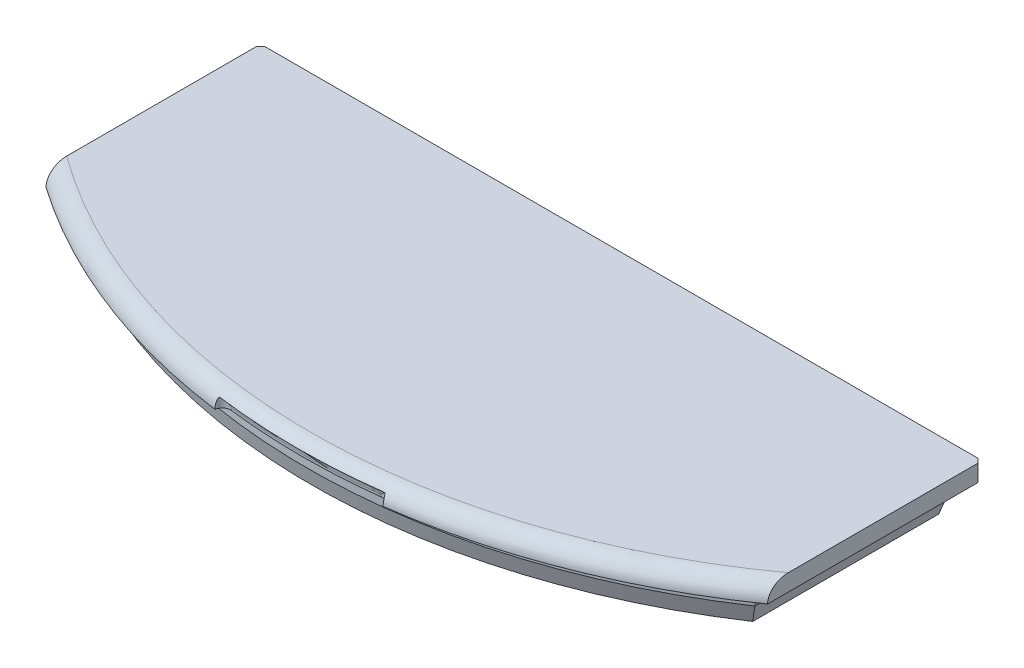
ISO-10303-21;
HEADER;
FILE_DESCRIPTION(('STEP AP214'),'2;1');
FILE_NAME('part.step','',(''),(''),'','','');
FILE_SCHEMA(('AUTOMOTIVE_DESIGN { 1 0 10303 214 1 1 1 1 }'));
ENDSEC;
DATA;
#1=APPLICATION_CONTEXT('core data for automotive mechanical design processes');
#2=APPLICATION_PROTOCOL_DEFINITION('international standard','automotive_design',2000,#1);
#3=PRODUCT_CONTEXT('',#1,'mechanical');
#4=PRODUCT('Part','Part','',(#3));
#5=PRODUCT_RELATED_PRODUCT_CATEGORY('part','',(#4));
#6=PRODUCT_DEFINITION_FORMATION('','',#4);
#7=PRODUCT_DEFINITION_CONTEXT('part definition',#1,'design');
#8=PRODUCT_DEFINITION('design','',#6,#7);
#9=PRODUCT_DEFINITION_SHAPE('','',#8);
#10=(LENGTH_UNIT() NAMED_UNIT(*) SI_UNIT(.MILLI.,.METRE.));
#11=(NAMED_UNIT(*) PLANE_ANGLE_UNIT() SI_UNIT($,.RADIAN.));
#12=(NAMED_UNIT(*) SI_UNIT($,.STERADIAN.) SOLID_ANGLE_UNIT());
#13=UNCERTAINTY_MEASURE_WITH_UNIT(LENGTH_MEASURE(1.E-05),#10,'distance_accuracy_value','');
#14=(GEOMETRIC_REPRESENTATION_CONTEXT(3) GLOBAL_UNCERTAINTY_ASSIGNED_CONTEXT((#13)) GLOBAL_UNIT_ASSIGNED_CONTEXT((#10,
#11,#12)) REPRESENTATION_CONTEXT('',''));
#15=CARTESIAN_POINT('',(0.,0.,0.));
#16=DIRECTION('',(0.,0.,1.));
#17=DIRECTION('',(1.,0.,0.));
#18=AXIS2_PLACEMENT_3D('',#15,#16,#17);
#19=CARTESIAN_POINT('',(0.,0.,0.));
#20=DIRECTION('',(0.,1.,0.));
#21=DIRECTION('',(0.,0.,1.));
#22=AXIS2_PLACEMENT_3D('',#19,#20,#21);
#23=PLANE('',#22);
#24=CARTESIAN_POINT('',(0.,0.,0.));
#25=DIRECTION('',(0.,1.,0.));
#26=DIRECTION('',(0.,0.,-1.));
#27=AXIS2_PLACEMENT_3D('',#24,#25,#26);
#28=CIRCLE('',#27,148.);
#29=CARTESIAN_POINT('',(-17.7759087870705,0.,146.928612144789));
#30=VERTEX_POINT('',#29);
#31=CARTESIAN_POINT('',(17.7759087870712,0.,146.928612144789));
#32=VERTEX_POINT('',#31);
#33=EDGE_CURVE('E231',#30,#32,#28,.T.);
#34=ORIENTED_EDGE('',*,*,#33,.F.);
#35=CARTESIAN_POINT('',(-18.0161237706795,0.,148.914133930529));
#36=DIRECTION('',(0.,1.,0.));
#37=DIRECTION('',(0.,0.,1.));
#38=AXIS2_PLACEMENT_3D('',#35,#36,#37);
#39=CIRCLE('',#38,2.);
#40=CARTESIAN_POINT('',(-20.,0.,148.660687473185));
#41=VERTEX_POINT('',#40);
#42=EDGE_CURVE('E180',#30,#41,#39,.T.);
#43=ORIENTED_EDGE('',*,*,#42,.T.);
#44=CARTESIAN_POINT('',(0.,0.,0.));
#45=DIRECTION('',(0.,1.,0.));
#46=DIRECTION('',(0.,0.,1.));
#47=AXIS2_PLACEMENT_3D('',#44,#45,#46);
#48=CIRCLE('',#47,150.);
#49=CARTESIAN_POINT('',(-85.8000000000001,0.,123.038042897309));
#50=VERTEX_POINT('',#49);
#51=EDGE_CURVE('E189',#50,#41,#48,.T.);
#52=ORIENTED_EDGE('',*,*,#51,.F.);
#53=DIRECTION('',(0.,0.,1.));
#54=VECTOR('',#53,1.);
#55=CARTESIAN_POINT('',(-85.8,0.,72.));
#56=LINE('',#55,#54);
#57=CARTESIAN_POINT('',(-85.8,0.,73.));
#58=VERTEX_POINT('',#57);
#59=EDGE_CURVE('E190',#58,#50,#56,.T.);
#60=ORIENTED_EDGE('',*,*,#59,.F.);
#61=DIRECTION('',(-0.707106781186548,0.,0.707106781186548));
#62=VECTOR('',#61,1.);
#63=CARTESIAN_POINT('',(-85.8,0.,73.));
#64=LINE('',#63,#62);
#65=CARTESIAN_POINT('',(-84.8,0.,72.));
#66=VERTEX_POINT('',#65);
#67=EDGE_CURVE('E256',#58,#66,#64,.F.);
#68=ORIENTED_EDGE('',*,*,#67,.T.);
#69=DIRECTION('',(-1.,0.,0.));
#70=VECTOR('',#69,1.);
#71=CARTESIAN_POINT('',(85.8,0.,72.));
#72=LINE('',#71,#70);
#73=CARTESIAN_POINT('',(84.8000000000001,0.,72.));
#74=VERTEX_POINT('',#73);
#75=EDGE_CURVE('E407',#74,#66,#72,.T.);
#76=ORIENTED_EDGE('',*,*,#75,.F.);
#77=DIRECTION('',(-0.707106781186548,0.,-0.707106781186548));
#78=VECTOR('',#77,1.);
#79=CARTESIAN_POINT('',(84.8000000000001,0.,72.));
#80=LINE('',#79,#78);
#81=CARTESIAN_POINT('',(85.8,0.,72.9999999999999));
#82=VERTEX_POINT('',#81);
#83=EDGE_CURVE('E253',#74,#82,#80,.F.);
#84=ORIENTED_EDGE('',*,*,#83,.T.);
#85=DIRECTION('',(0.,0.,-1.));
#86=VECTOR('',#85,1.);
#87=CARTESIAN_POINT('',(85.8,0.,72.));
#88=LINE('',#87,#86);
#89=CARTESIAN_POINT('',(85.8000000000001,0.,123.038042897309));
#90=VERTEX_POINT('',#89);
#91=EDGE_CURVE('E187',#90,#82,#88,.T.);
#92=ORIENTED_EDGE('',*,*,#91,.F.);
#93=CARTESIAN_POINT('',(20.,0.,148.660687473185));
#94=VERTEX_POINT('',#93);
#95=EDGE_CURVE('E184',#94,#90,#48,.T.);
#96=ORIENTED_EDGE('',*,*,#95,.F.);
#97=CARTESIAN_POINT('',(18.0161237706803,0.,148.914133930529));
#98=DIRECTION('',(0.,1.,0.));
#99=DIRECTION('',(0.,0.,1.));
#100=AXIS2_PLACEMENT_3D('',#97,#98,#99);
#101=CIRCLE('',#100,2.);
#102=EDGE_CURVE('E172',#94,#32,#101,.T.);
#103=ORIENTED_EDGE('',*,*,#102,.T.);
#104=EDGE_LOOP('',(#34,#43,#52,#60,#68,#76,#84,#92,#96,#103));
#105=FACE_BOUND('',#104,.T.);
#106=CARTESIAN_POINT('',(0.,0.,0.));
#107=DIRECTION('',(0.,-1.,0.));
#108=DIRECTION('',(0.,0.,-1.));
#109=AXIS2_PLACEMENT_3D('',#106,#107,#108);
#110=CIRCLE('',#109,146.8);
#111=CARTESIAN_POINT('',(81.7,0.,121.964544028172));
#112=VERTEX_POINT('',#111);
#113=CARTESIAN_POINT('',(-81.7,0.,121.964544028172));
#114=VERTEX_POINT('',#113);
#115=EDGE_CURVE('E387',#112,#114,#110,.T.);
#116=ORIENTED_EDGE('',*,*,#115,.F.);
#117=DIRECTION('',(0.,0.,1.));
#118=VECTOR('',#117,1.);
#119=CARTESIAN_POINT('',(81.7,0.,76.1));
#120=LINE('',#119,#118);
#121=CARTESIAN_POINT('',(81.7,0.,76.1));
#122=VERTEX_POINT('',#121);
#123=EDGE_CURVE('E396',#122,#112,#120,.T.);
#124=ORIENTED_EDGE('',*,*,#123,.F.);
#125=DIRECTION('',(1.,0.,0.));
#126=VECTOR('',#125,1.);
#127=CARTESIAN_POINT('',(81.7,0.,76.1));
#128=LINE('',#127,#126);
#129=CARTESIAN_POINT('',(-81.7,0.,76.1));
#130=VERTEX_POINT('',#129);
#131=EDGE_CURVE('E393',#130,#122,#128,.T.);
#132=ORIENTED_EDGE('',*,*,#131,.F.);
#133=DIRECTION('',(0.,0.,-1.));
#134=VECTOR('',#133,1.);
#135=CARTESIAN_POINT('',(-81.7,0.,76.1));
#136=LINE('',#135,#134);
#137=EDGE_CURVE('E390',#114,#130,#136,.T.);
#138=ORIENTED_EDGE('',*,*,#137,.F.);
#139=EDGE_LOOP('',(#116,#124,#132,#138));
#140=FACE_BOUND('',#139,.T.);
#141=ADVANCED_FACE('F32',(#105,#140),#23,.F.);
#142=CARTESIAN_POINT('',(85.8,4.,72.));
#143=DIRECTION('',(0.,0.,1.));
#144=DIRECTION('',(1.,0.,0.));
#145=AXIS2_PLACEMENT_3D('',#142,#143,#144);
#146=PLANE('',#145);
#147=ORIENTED_EDGE('',*,*,#75,.T.);
#148=DIRECTION('',(0.,1.,0.));
#149=VECTOR('',#148,1.);
#150=CARTESIAN_POINT('',(-84.8,4.,72.));
#151=LINE('',#150,#149);
#152=CARTESIAN_POINT('',(-84.8,4.,72.));
#153=VERTEX_POINT('',#152);
#154=EDGE_CURVE('E261',#66,#153,#151,.T.);
#155=ORIENTED_EDGE('',*,*,#154,.T.);
#156=DIRECTION('',(-1.,0.,0.));
#157=VECTOR('',#156,1.);
#158=CARTESIAN_POINT('',(85.8,4.,72.));
#159=LINE('',#158,#157);
#160=CARTESIAN_POINT('',(84.8000000000001,4.,72.));
#161=VERTEX_POINT('',#160);
#162=EDGE_CURVE('E245',#161,#153,#159,.T.);
#163=ORIENTED_EDGE('',*,*,#162,.F.);
#164=DIRECTION('',(0.,-1.,0.));
#165=VECTOR('',#164,1.);
#166=CARTESIAN_POINT('',(84.8000000000001,4.,72.));
#167=LINE('',#166,#165);
#168=EDGE_CURVE('E258',#161,#74,#167,.T.);
#169=ORIENTED_EDGE('',*,*,#168,.T.);
#170=EDGE_LOOP('',(#147,#155,#163,#169));
#171=FACE_BOUND('',#170,.T.);
#172=ADVANCED_FACE('F342',(#171),#146,.F.);
#173=CARTESIAN_POINT('',(-85.8,4.,72.));
#174=DIRECTION('',(1.,0.,0.));
#175=DIRECTION('',(0.,0.,-1.));
#176=AXIS2_PLACEMENT_3D('',#173,#174,#175);
#177=PLANE('',#176);
#178=ORIENTED_EDGE('',*,*,#59,.T.);
#179=CARTESIAN_POINT('',(-85.8000000000001,0.,123.038042897309));
#180=CARTESIAN_POINT('',(-85.8000000000001,0.0980519221107378,123.038065669887));
#181=CARTESIAN_POINT('',(-85.8000000000001,0.196092309239102,123.033648191387));
#182=CARTESIAN_POINT('',(-85.8,0.391350132556224,123.016107250504));
#183=CARTESIAN_POINT('',(-85.8000000000001,0.48856790466238,123.002987534587));
#184=CARTESIAN_POINT('',(-85.8000000000001,0.680958857251807,122.968307829757));
#185=CARTESIAN_POINT('',(-85.8000000000001,0.776140103691755,122.946792609638));
#186=CARTESIAN_POINT('',(-85.8000000000001,0.964277652757019,122.895657739189));
#187=CARTESIAN_POINT('',(-85.8000000000001,1.05723381469018,122.866037577846));
#188=CARTESIAN_POINT('',(-85.8000000000001,1.3315586864647,122.765684983804));
#189=CARTESIAN_POINT('',(-85.8000000000001,1.5088210215736,122.683379395804));
#190=CARTESIAN_POINT('',(-85.8000000000001,1.84818656576364,122.491928211225));
#191=CARTESIAN_POINT('',(-85.8000000000001,2.0102724899054,122.382752512538));
#192=CARTESIAN_POINT('',(-85.8000000000001,2.32653819048473,122.134283470523));
#193=CARTESIAN_POINT('',(-85.8000000000001,2.47955297391297,121.993512550613));
#194=CARTESIAN_POINT('',(-85.8000000000001,2.76391821232549,121.691706320581));
#195=CARTESIAN_POINT('',(-85.8000000000001,2.8952629267089,121.530665660672));
#196=CARTESIAN_POINT('',(-85.8000000000001,3.15621972306849,121.163963253156));
#197=CARTESIAN_POINT('',(-85.8000000000001,3.28171510402984,120.955375780777));
#198=CARTESIAN_POINT('',(-85.8000000000001,3.50223042985736,120.522597034053));
#199=CARTESIAN_POINT('',(-85.8000000000001,3.59721812835487,120.298389552007));
#200=CARTESIAN_POINT('',(-85.8000000000001,3.77188116184814,119.796985240663));
#201=CARTESIAN_POINT('',(-85.8000000000001,3.84545996963184,119.51766648769));
#202=CARTESIAN_POINT('',(-85.8000000000001,3.95107849197288,118.951672801187));
#203=CARTESIAN_POINT('',(-85.8000000000001,3.98317104700719,118.665007700414));
#204=CARTESIAN_POINT('',(-85.8000000000001,3.99830609059583,118.294719633731));
#205=CARTESIAN_POINT('',(-85.8000000000001,3.99999942943627,118.211631788594));
#206=CARTESIAN_POINT('',(-85.8000000000001,4.,118.128574020006));
#207=B_SPLINE_CURVE_WITH_KNOTS('',3,(#179,#180,#181,#182,#183,#184,#185,#186,#187,#188,#189,
#190,#191,#192,#193,#194,#195,#196,#197,#198,#199,#200,#201,#202,#203,#204,#205,#206),
.UNSPECIFIED.,.F.,.F.,(4,2,2,2,2,2,2,2,2,2,2,2,2,4),(0.,0.29403718752008,0.587947868921189,
0.88031223864239,1.17269504599903,1.75614381085935,2.34024920214999,2.96163726363771,
3.58318967315333,4.31075769126483,5.0390922310207,5.90235313226644,6.76451342294618,
7.01375002399719),.UNSPECIFIED.);
#208=CARTESIAN_POINT('',(-85.8000000000001,4.,118.128574020006));
#209=VERTEX_POINT('',#208);
#210=EDGE_CURVE('E11',#50,#209,#207,.T.);
#211=ORIENTED_EDGE('',*,*,#210,.T.);
#212=DIRECTION('',(0.,0.,1.));
#213=VECTOR('',#212,1.);
#214=CARTESIAN_POINT('',(-85.8,4.,72.));
#215=LINE('',#214,#213);
#216=CARTESIAN_POINT('',(-85.8,4.,73.));
#217=VERTEX_POINT('',#216);
#218=EDGE_CURVE('E410',#217,#209,#215,.T.);
#219=ORIENTED_EDGE('',*,*,#218,.F.);
#220=DIRECTION('',(0.,-1.,0.));
#221=VECTOR('',#220,1.);
#222=CARTESIAN_POINT('',(-85.8,4.,73.));
#223=LINE('',#222,#221);
#224=EDGE_CURVE('E250',#217,#58,#223,.T.);
#225=ORIENTED_EDGE('',*,*,#224,.T.);
#226=EDGE_LOOP('',(#178,#211,#219,#225));
#227=FACE_BOUND('',#226,.T.);
#228=ADVANCED_FACE('F347',(#227),#177,.F.);
#229=CARTESIAN_POINT('',(85.8,4.,72.));
#230=DIRECTION('',(-1.,0.,0.));
#231=DIRECTION('',(0.,0.,1.));
#232=AXIS2_PLACEMENT_3D('',#229,#230,#231);
#233=PLANE('',#232);
#234=DIRECTION('',(0.,0.,-1.));
#235=VECTOR('',#234,1.);
#236=CARTESIAN_POINT('',(85.8,4.,72.));
#237=LINE('',#236,#235);
#238=CARTESIAN_POINT('',(85.8000000000001,4.,118.128574020006));
#239=VERTEX_POINT('',#238);
#240=CARTESIAN_POINT('',(85.8,4.,72.9999999999999));
#241=VERTEX_POINT('',#240);
#242=EDGE_CURVE('E254',#239,#241,#237,.T.);
#243=ORIENTED_EDGE('',*,*,#242,.F.);
#244=CARTESIAN_POINT('',(85.8000000000001,4.,118.128574020006));
#245=CARTESIAN_POINT('',(85.8000000000001,3.99997246398216,118.298028212089));
#246=CARTESIAN_POINT('',(85.8000000000001,3.99294676090189,118.467389574089));
#247=CARTESIAN_POINT('',(85.8000000000001,3.96470198796878,118.805058150863));
#248=CARTESIAN_POINT('',(85.8000000000001,3.94347149449724,118.973364407065));
#249=CARTESIAN_POINT('',(85.8000000000001,3.85793996316242,119.476476809727));
#250=CARTESIAN_POINT('',(85.8000000000001,3.77179512597632,119.807945506012));
#251=CARTESIAN_POINT('',(85.8000000000001,3.56160265915137,120.3899047389));
#252=CARTESIAN_POINT('',(85.8000000000001,3.44751133177034,120.644034119264));
#253=CARTESIAN_POINT('',(85.8000000000001,3.17952777641685,121.12987132254));
#254=CARTESIAN_POINT('',(85.8000000000001,3.02574559337648,121.361638742274));
#255=CARTESIAN_POINT('',(85.8000000000001,2.70912969465403,121.755730146958));
#256=CARTESIAN_POINT('',(85.8000000000001,2.5526302474475,121.923101218924));
#257=CARTESIAN_POINT('',(85.8000000000001,2.2989276173519,122.153213611012));
#258=CARTESIAN_POINT('',(85.8000000000001,2.21113446921405,122.22647005702));
#259=CARTESIAN_POINT('',(85.8000000000001,2.02956637579846,122.365119331196));
#260=CARTESIAN_POINT('',(85.8000000000001,1.93579412399646,122.430515662428));
#261=CARTESIAN_POINT('',(85.8000000000001,1.74184945299988,122.553126236148));
#262=CARTESIAN_POINT('',(85.8000000000001,1.6416270293435,122.610261545698));
#263=CARTESIAN_POINT('',(85.8000000000001,1.43624909635406,122.714727219795));
#264=CARTESIAN_POINT('',(85.8000000000001,1.33109635292404,122.762063003021));
#265=CARTESIAN_POINT('',(85.8000000000001,1.11680907452566,122.846073541071));
#266=CARTESIAN_POINT('',(85.8000000000001,1.00768155050616,122.882766132785));
#267=CARTESIAN_POINT('',(85.8000000000001,0.786322463177349,122.944882598827));
#268=CARTESIAN_POINT('',(85.8000000000001,0.674092959810069,122.970313769217));
#269=CARTESIAN_POINT('',(85.8000000000001,0.468245585035945,123.005855897741));
#270=CARTESIAN_POINT('',(85.8000000000001,0.374959786418973,123.017913269935));
#271=CARTESIAN_POINT('',(85.8000000000001,0.187787802026001,123.034012107969));
#272=CARTESIAN_POINT('',(85.8000000000001,0.0939022560749748,123.03806102625));
#273=CARTESIAN_POINT('',(85.8000000000001,0.,123.038042897309));
#274=B_SPLINE_CURVE_WITH_KNOTS('',3,(#244,#245,#246,#247,#248,#249,#250,#251,#252,#253,#254,
#255,#256,#257,#258,#259,#260,#261,#262,#263,#264,#265,#266,#267,#268,#269,#270,#271,#272,#273),
.UNSPECIFIED.,.F.,.F.,(4,2,2,2,2,2,2,2,2,2,2,2,2,2,4),(0.,0.50802317932023,1.01645540725722,
2.03785592480925,2.8703562168338,3.70057270040848,4.38496512047787,4.7276314387256,
5.07014446805515,5.41574000617797,5.76114393270248,6.10596560844596,6.45056355272586,
6.73241524820199,7.01400453682334),.UNSPECIFIED.);
#275=EDGE_CURVE('E193',#239,#90,#274,.T.);
#276=ORIENTED_EDGE('',*,*,#275,.T.);
#277=ORIENTED_EDGE('',*,*,#91,.T.);
#278=DIRECTION('',(0.,1.,0.));
#279=VECTOR('',#278,1.);
#280=CARTESIAN_POINT('',(85.8,4.,72.9999999999999));
#281=LINE('',#280,#279);
#282=EDGE_CURVE('E267',#82,#241,#281,.T.);
#283=ORIENTED_EDGE('',*,*,#282,.T.);
#284=EDGE_LOOP('',(#243,#276,#277,#283));
#285=FACE_BOUND('',#284,.T.);
#286=ADVANCED_FACE('F429',(#285),#233,.F.);
#287=CARTESIAN_POINT('',(0.,4.,0.));
#288=DIRECTION('',(0.,1.,0.));
#289=DIRECTION('',(0.,0.,1.));
#290=AXIS2_PLACEMENT_3D('',#287,#288,#289);
#291=PLANE('',#290);
#292=ORIENTED_EDGE('',*,*,#218,.T.);
#293=CARTESIAN_POINT('',(0.,4.,0.));
#294=DIRECTION('',(0.,1.,0.));
#295=DIRECTION('',(0.,0.,1.));
#296=AXIS2_PLACEMENT_3D('',#293,#294,#295);
#297=CIRCLE('',#296,146.);
#298=EDGE_CURVE('E196',#209,#239,#297,.T.);
#299=ORIENTED_EDGE('',*,*,#298,.T.);
#300=ORIENTED_EDGE('',*,*,#242,.T.);
#301=DIRECTION('',(0.707106781186548,0.,0.707106781186548));
#302=VECTOR('',#301,1.);
#303=CARTESIAN_POINT('',(6.40000000000005,4.,-6.40000000000005));
#304=LINE('',#303,#302);
#305=EDGE_CURVE('E263',#241,#161,#304,.F.);
#306=ORIENTED_EDGE('',*,*,#305,.T.);
#307=ORIENTED_EDGE('',*,*,#162,.T.);
#308=DIRECTION('',(0.707106781186548,0.,-0.707106781186548));
#309=VECTOR('',#308,1.);
#310=CARTESIAN_POINT('',(-6.40000000000002,4.,-6.40000000000002));
#311=LINE('',#310,#309);
#312=EDGE_CURVE('E265',#153,#217,#311,.F.);
#313=ORIENTED_EDGE('',*,*,#312,.T.);
#314=EDGE_LOOP('',(#292,#299,#300,#306,#307,#313));
#315=FACE_BOUND('',#314,.T.);
#316=ADVANCED_FACE('F423',(#315),#291,.T.);
#317=CARTESIAN_POINT('',(-85.8,4.,73.));
#318=DIRECTION('',(0.707106781186547,0.,0.707106781186547));
#319=DIRECTION('',(0.,-1.,0.));
#320=AXIS2_PLACEMENT_3D('',#317,#318,#319);
#321=PLANE('',#320);
#322=ORIENTED_EDGE('',*,*,#312,.F.);
#323=ORIENTED_EDGE('',*,*,#154,.F.);
#324=ORIENTED_EDGE('',*,*,#67,.F.);
#325=ORIENTED_EDGE('',*,*,#224,.F.);
#326=EDGE_LOOP('',(#322,#323,#324,#325));
#327=FACE_BOUND('',#326,.T.);
#328=ADVANCED_FACE('F420',(#327),#321,.F.);
#329=CARTESIAN_POINT('',(84.8000000000001,4.,72.));
#330=DIRECTION('',(-0.707106781186547,0.,0.707106781186547));
#331=DIRECTION('',(0.,-1.,0.));
#332=AXIS2_PLACEMENT_3D('',#329,#330,#331);
#333=PLANE('',#332);
#334=ORIENTED_EDGE('',*,*,#305,.F.);
#335=ORIENTED_EDGE('',*,*,#282,.F.);
#336=ORIENTED_EDGE('',*,*,#83,.F.);
#337=ORIENTED_EDGE('',*,*,#168,.F.);
#338=EDGE_LOOP('',(#334,#335,#336,#337));
#339=FACE_BOUND('',#338,.T.);
#340=ADVANCED_FACE('F427',(#339),#333,.F.);
#341=CARTESIAN_POINT('',(0.,-7.,0.));
#342=DIRECTION('',(0.,-1.,0.));
#343=DIRECTION('',(0.,0.,-1.));
#344=AXIS2_PLACEMENT_3D('',#341,#342,#343);
#345=PLANE('',#344);
#346=DIRECTION('',(1.,0.,0.));
#347=VECTOR('',#346,1.);
#348=CARTESIAN_POINT('',(81.7,-7.,77.1717967697245));
#349=LINE('',#348,#347);
#350=CARTESIAN_POINT('',(-80.6282032302756,-7.,77.1717967697245));
#351=VERTEX_POINT('',#350);
#352=CARTESIAN_POINT('',(80.6282032302756,-7.,77.1717967697245));
#353=VERTEX_POINT('',#352);
#354=EDGE_CURVE('E270',#351,#353,#349,.T.);
#355=ORIENTED_EDGE('',*,*,#354,.T.);
#356=DIRECTION('',(0.,0.,1.));
#357=VECTOR('',#356,1.);
#358=CARTESIAN_POINT('',(80.6282032302755,-7.,121.964544028172));
#359=LINE('',#358,#357);
#360=CARTESIAN_POINT('',(80.6282032302755,-7.,121.391111950513));
#361=VERTEX_POINT('',#360);
#362=EDGE_CURVE('E276',#353,#361,#359,.T.);
#363=ORIENTED_EDGE('',*,*,#362,.T.);
#364=CARTESIAN_POINT('',(0.,-7.,0.));
#365=DIRECTION('',(0.,-1.,0.));
#366=DIRECTION('',(0.,0.,-1.));
#367=AXIS2_PLACEMENT_3D('',#364,#365,#366);
#368=CIRCLE('',#367,145.728203230276);
#369=CARTESIAN_POINT('',(-80.6282032302756,-7.,121.391111950513));
#370=VERTEX_POINT('',#369);
#371=EDGE_CURVE('E274',#361,#370,#368,.T.);
#372=ORIENTED_EDGE('',*,*,#371,.T.);
#373=DIRECTION('',(0.,0.,-1.));
#374=VECTOR('',#373,1.);
#375=CARTESIAN_POINT('',(-80.6282032302756,-7.,76.1));
#376=LINE('',#375,#374);
#377=EDGE_CURVE('E272',#370,#351,#376,.T.);
#378=ORIENTED_EDGE('',*,*,#377,.T.);
#379=EDGE_LOOP('',(#355,#363,#372,#378));
#380=FACE_BOUND('',#379,.T.);
#381=DIRECTION('',(0.,0.,-1.));
#382=VECTOR('',#381,1.);
#383=CARTESIAN_POINT('',(-77.8000000000001,-7.,80.));
#384=LINE('',#383,#382);
#385=CARTESIAN_POINT('',(-77.8000000000001,-7.,119.745563592143));
#386=VERTEX_POINT('',#385);
#387=CARTESIAN_POINT('',(-77.8000000000001,-7.,80.));
#388=VERTEX_POINT('',#387);
#389=EDGE_CURVE('E371',#386,#388,#384,.T.);
#390=ORIENTED_EDGE('',*,*,#389,.F.);
#391=CARTESIAN_POINT('',(0.,-7.,0.));
#392=DIRECTION('',(0.,-1.,0.));
#393=DIRECTION('',(0.,0.,-1.));
#394=AXIS2_PLACEMENT_3D('',#391,#392,#393);
#395=CIRCLE('',#394,142.8);
#396=CARTESIAN_POINT('',(77.8,-7.,119.745563592143));
#397=VERTEX_POINT('',#396);
#398=EDGE_CURVE('E369',#397,#386,#395,.T.);
#399=ORIENTED_EDGE('',*,*,#398,.F.);
#400=DIRECTION('',(0.,0.,1.));
#401=VECTOR('',#400,1.);
#402=CARTESIAN_POINT('',(77.8000000000001,-7.,80.));
#403=LINE('',#402,#401);
#404=CARTESIAN_POINT('',(77.8000000000001,-7.,80.));
#405=VERTEX_POINT('',#404);
#406=EDGE_CURVE('E380',#405,#397,#403,.T.);
#407=ORIENTED_EDGE('',*,*,#406,.F.);
#408=DIRECTION('',(1.,0.,0.));
#409=VECTOR('',#408,1.);
#410=CARTESIAN_POINT('',(-77.8000000000001,-7.,80.));
#411=LINE('',#410,#409);
#412=EDGE_CURVE('E651',#388,#405,#411,.T.);
#413=ORIENTED_EDGE('',*,*,#412,.F.);
#414=EDGE_LOOP('',(#390,#399,#407,#413));
#415=FACE_BOUND('',#414,.T.);
#416=ADVANCED_FACE('F440',(#380,#415),#345,.T.);
#417=CARTESIAN_POINT('',(0.,-7.,0.));
#418=DIRECTION('',(0.,1.,0.));
#419=DIRECTION('',(0.,0.,1.));
#420=AXIS2_PLACEMENT_3D('',#417,#418,#419);
#421=CYLINDRICAL_SURFACE('',#420,146.8);
#422=DIRECTION('',(0.,1.,0.));
#423=VECTOR('',#422,1.);
#424=CARTESIAN_POINT('',(-81.7,-7.,121.964544028172));
#425=LINE('',#424,#423);
#426=CARTESIAN_POINT('',(-81.7,-2.99999999999991,121.964544028172));
#427=VERTEX_POINT('',#426);
#428=EDGE_CURVE('E405',#427,#114,#425,.T.);
#429=ORIENTED_EDGE('',*,*,#428,.F.);
#430=CARTESIAN_POINT('',(0.,-2.99999999999991,0.));
#431=DIRECTION('',(0.,-1.,0.));
#432=DIRECTION('',(0.,0.,-1.));
#433=AXIS2_PLACEMENT_3D('',#430,#431,#432);
#434=CIRCLE('',#433,146.8);
#435=CARTESIAN_POINT('',(81.7,-2.99999999999991,121.964544028172));
#436=VERTEX_POINT('',#435);
#437=EDGE_CURVE('E282',#427,#436,#434,.F.);
#438=ORIENTED_EDGE('',*,*,#437,.T.);
#439=DIRECTION('',(0.,1.,0.));
#440=VECTOR('',#439,1.);
#441=CARTESIAN_POINT('',(81.7,-7.,121.964544028172));
#442=LINE('',#441,#440);
#443=EDGE_CURVE('E399',#436,#112,#442,.T.);
#444=ORIENTED_EDGE('',*,*,#443,.T.);
#445=ORIENTED_EDGE('',*,*,#115,.T.);
#446=EDGE_LOOP('',(#429,#438,#444,#445));
#447=FACE_BOUND('',#446,.T.);
#448=ADVANCED_FACE('F444',(#447),#421,.T.);
#449=CARTESIAN_POINT('',(-81.7,-7.,76.1));
#450=DIRECTION('',(1.,0.,0.));
#451=DIRECTION('',(0.,0.,-1.));
#452=AXIS2_PLACEMENT_3D('',#449,#450,#451);
#453=PLANE('',#452);
#454=DIRECTION('',(0.,1.,0.));
#455=VECTOR('',#454,1.);
#456=CARTESIAN_POINT('',(-81.7,-7.,76.1));
#457=LINE('',#456,#455);
#458=CARTESIAN_POINT('',(-81.7,-2.99999999999991,76.1));
#459=VERTEX_POINT('',#458);
#460=EDGE_CURVE('E403',#459,#130,#457,.T.);
#461=ORIENTED_EDGE('',*,*,#460,.F.);
#462=DIRECTION('',(0.,0.,1.));
#463=VECTOR('',#462,1.);
#464=CARTESIAN_POINT('',(-81.7,-2.99999999999991,121.964544028172));
#465=LINE('',#464,#463);
#466=EDGE_CURVE('E284',#459,#427,#465,.T.);
#467=ORIENTED_EDGE('',*,*,#466,.T.);
#468=ORIENTED_EDGE('',*,*,#428,.T.);
#469=ORIENTED_EDGE('',*,*,#137,.T.);
#470=EDGE_LOOP('',(#461,#467,#468,#469));
#471=FACE_BOUND('',#470,.T.);
#472=ADVANCED_FACE('F450',(#471),#453,.F.);
#473=CARTESIAN_POINT('',(81.7,-7.,76.1));
#474=DIRECTION('',(0.,0.,1.));
#475=DIRECTION('',(1.,0.,0.));
#476=AXIS2_PLACEMENT_3D('',#473,#474,#475);
#477=PLANE('',#476);
#478=DIRECTION('',(0.,1.,0.));
#479=VECTOR('',#478,1.);
#480=CARTESIAN_POINT('',(81.7,-7.,76.1));
#481=LINE('',#480,#479);
#482=CARTESIAN_POINT('',(81.7,-2.99999999999991,76.1));
#483=VERTEX_POINT('',#482);
#484=EDGE_CURVE('E401',#483,#122,#481,.T.);
#485=ORIENTED_EDGE('',*,*,#484,.F.);
#486=DIRECTION('',(-1.,0.,0.));
#487=VECTOR('',#486,1.);
#488=CARTESIAN_POINT('',(-81.7,-2.99999999999991,76.1));
#489=LINE('',#488,#487);
#490=EDGE_CURVE('E286',#483,#459,#489,.T.);
#491=ORIENTED_EDGE('',*,*,#490,.T.);
#492=ORIENTED_EDGE('',*,*,#460,.T.);
#493=ORIENTED_EDGE('',*,*,#131,.T.);
#494=EDGE_LOOP('',(#485,#491,#492,#493));
#495=FACE_BOUND('',#494,.T.);
#496=ADVANCED_FACE('F461',(#495),#477,.F.);
#497=CARTESIAN_POINT('',(81.7,-7.,76.1));
#498=DIRECTION('',(-1.,0.,0.));
#499=DIRECTION('',(0.,0.,1.));
#500=AXIS2_PLACEMENT_3D('',#497,#498,#499);
#501=PLANE('',#500);
#502=ORIENTED_EDGE('',*,*,#443,.F.);
#503=DIRECTION('',(0.,0.,-1.));
#504=VECTOR('',#503,1.);
#505=CARTESIAN_POINT('',(81.7,-2.99999999999991,76.1));
#506=LINE('',#505,#504);
#507=EDGE_CURVE('E279',#436,#483,#506,.T.);
#508=ORIENTED_EDGE('',*,*,#507,.T.);
#509=ORIENTED_EDGE('',*,*,#484,.T.);
#510=ORIENTED_EDGE('',*,*,#123,.T.);
#511=EDGE_LOOP('',(#502,#508,#509,#510));
#512=FACE_BOUND('',#511,.T.);
#513=ADVANCED_FACE('F458',(#512),#501,.F.);
#514=CARTESIAN_POINT('',(0.,-7.,0.));
#515=DIRECTION('',(0.,1.,0.));
#516=DIRECTION('',(0.,0.,1.));
#517=AXIS2_PLACEMENT_3D('',#514,#515,#516);
#518=CYLINDRICAL_SURFACE('',#517,142.8);
#519=CARTESIAN_POINT('',(0.,0.,0.));
#520=DIRECTION('',(0.,-1.,0.));
#521=DIRECTION('',(0.,0.,-1.));
#522=AXIS2_PLACEMENT_3D('',#519,#520,#521);
#523=CIRCLE('',#522,142.8);
#524=CARTESIAN_POINT('',(77.8,0.,119.745563592143));
#525=VERTEX_POINT('',#524);
#526=CARTESIAN_POINT('',(-77.8000000000001,0.,119.745563592143));
#527=VERTEX_POINT('',#526);
#528=EDGE_CURVE('E324',#525,#527,#523,.T.);
#529=ORIENTED_EDGE('',*,*,#528,.F.);
#530=DIRECTION('',(0.,1.,0.));
#531=VECTOR('',#530,1.);
#532=CARTESIAN_POINT('',(77.8,-7.,119.745563592143));
#533=LINE('',#532,#531);
#534=EDGE_CURVE('E377',#397,#525,#533,.T.);
#535=ORIENTED_EDGE('',*,*,#534,.F.);
#536=ORIENTED_EDGE('',*,*,#398,.T.);
#537=DIRECTION('',(0.,1.,0.));
#538=VECTOR('',#537,1.);
#539=CARTESIAN_POINT('',(-77.8000000000001,-7.,119.745563592143));
#540=LINE('',#539,#538);
#541=EDGE_CURVE('E384',#386,#527,#540,.T.);
#542=ORIENTED_EDGE('',*,*,#541,.T.);
#543=EDGE_LOOP('',(#529,#535,#536,#542));
#544=FACE_BOUND('',#543,.T.);
#545=ADVANCED_FACE('F456',(#544),#518,.F.);
#546=CARTESIAN_POINT('',(-77.8000000000001,-7.,80.));
#547=DIRECTION('',(1.,0.,0.));
#548=DIRECTION('',(0.,0.,-1.));
#549=AXIS2_PLACEMENT_3D('',#546,#547,#548);
#550=PLANE('',#549);
#551=DIRECTION('',(0.,0.,-1.));
#552=VECTOR('',#551,1.);
#553=CARTESIAN_POINT('',(-77.8000000000001,0.,80.));
#554=LINE('',#553,#552);
#555=CARTESIAN_POINT('',(-77.8000000000001,0.,80.));
#556=VERTEX_POINT('',#555);
#557=EDGE_CURVE('E373',#527,#556,#554,.T.);
#558=ORIENTED_EDGE('',*,*,#557,.F.);
#559=ORIENTED_EDGE('',*,*,#541,.F.);
#560=ORIENTED_EDGE('',*,*,#389,.T.);
#561=DIRECTION('',(0.,1.,0.));
#562=VECTOR('',#561,1.);
#563=CARTESIAN_POINT('',(-77.8000000000001,-7.,80.));
#564=LINE('',#563,#562);
#565=EDGE_CURVE('E382',#388,#556,#564,.T.);
#566=ORIENTED_EDGE('',*,*,#565,.T.);
#567=EDGE_LOOP('',(#558,#559,#560,#566));
#568=FACE_BOUND('',#567,.T.);
#569=ADVANCED_FACE('F552',(#568),#550,.T.);
#570=CARTESIAN_POINT('',(-77.8000000000001,-7.,80.));
#571=DIRECTION('',(0.,0.,1.));
#572=DIRECTION('',(1.,0.,0.));
#573=AXIS2_PLACEMENT_3D('',#570,#571,#572);
#574=PLANE('',#573);
#575=DIRECTION('',(1.,0.,0.));
#576=VECTOR('',#575,1.);
#577=CARTESIAN_POINT('',(-77.8000000000001,0.,80.));
#578=LINE('',#577,#576);
#579=CARTESIAN_POINT('',(77.8000000000001,0.,80.));
#580=VERTEX_POINT('',#579);
#581=EDGE_CURVE('E368',#556,#580,#578,.T.);
#582=ORIENTED_EDGE('',*,*,#581,.F.);
#583=ORIENTED_EDGE('',*,*,#565,.F.);
#584=ORIENTED_EDGE('',*,*,#412,.T.);
#585=DIRECTION('',(0.,1.,0.));
#586=VECTOR('',#585,1.);
#587=CARTESIAN_POINT('',(77.8000000000001,-7.,80.));
#588=LINE('',#587,#586);
#589=EDGE_CURVE('E379',#405,#580,#588,.T.);
#590=ORIENTED_EDGE('',*,*,#589,.T.);
#591=EDGE_LOOP('',(#582,#583,#584,#590));
#592=FACE_BOUND('',#591,.T.);
#593=ADVANCED_FACE('F357',(#592),#574,.T.);
#594=CARTESIAN_POINT('',(77.8000000000001,-7.,80.));
#595=DIRECTION('',(-1.,0.,0.));
#596=DIRECTION('',(0.,0.,1.));
#597=AXIS2_PLACEMENT_3D('',#594,#595,#596);
#598=PLANE('',#597);
#599=DIRECTION('',(0.,0.,1.));
#600=VECTOR('',#599,1.);
#601=CARTESIAN_POINT('',(77.8000000000001,0.,80.));
#602=LINE('',#601,#600);
#603=EDGE_CURVE('E364',#580,#525,#602,.T.);
#604=ORIENTED_EDGE('',*,*,#603,.F.);
#605=ORIENTED_EDGE('',*,*,#589,.F.);
#606=ORIENTED_EDGE('',*,*,#406,.T.);
#607=ORIENTED_EDGE('',*,*,#534,.T.);
#608=EDGE_LOOP('',(#604,#605,#606,#607));
#609=FACE_BOUND('',#608,.T.);
#610=ADVANCED_FACE('F352',(#609),#598,.T.);
#611=ORIENTED_EDGE('',*,*,#603,.T.);
#612=ORIENTED_EDGE('',*,*,#528,.T.);
#613=ORIENTED_EDGE('',*,*,#557,.T.);
#614=ORIENTED_EDGE('',*,*,#581,.T.);
#615=EDGE_LOOP('',(#611,#612,#613,#614));
#616=FACE_BOUND('',#615,.T.);
#617=ADVANCED_FACE('F312',(#616),#23,.F.);
#618=CARTESIAN_POINT('',(-80.6282032302756,-7.,0.));
#619=DIRECTION('',(-0.96592582628907,-0.258819045102516,0.));
#620=DIRECTION('',(0.,0.,1.));
#621=AXIS2_PLACEMENT_3D('',#618,#619,#620);
#622=PLANE('',#621);
#623=CARTESIAN_POINT('',(-80.6282032302756,-7.,121.391111950513));
#624=CARTESIAN_POINT('',(-80.8068281059937,-6.33336288832418,121.48690492781));
#625=CARTESIAN_POINT('',(-80.9854569413382,-5.66671099912163,121.582587422934));
#626=CARTESIAN_POINT('',(-81.3427225312464,-4.33337766578827,121.773731448821));
#627=CARTESIAN_POINT('',(-81.52135928581,-3.66669622165745,121.869192979583));
#628=CARTESIAN_POINT('',(-81.7,-2.99999999999992,121.964544028172));
#629=B_SPLINE_CURVE_WITH_KNOTS('',3,(#623,#624,#625,#626,#627,#628),.UNSPECIFIED.,.F.,.F.,(4,2,
4),(0.,2.0903093738976,4.1806187474027),.UNSPECIFIED.);
#630=EDGE_CURVE('E314',#427,#370,#629,.F.);
#631=ORIENTED_EDGE('',*,*,#630,.F.);
#632=ORIENTED_EDGE('',*,*,#466,.F.);
#633=DIRECTION('',(-0.250562807085727,0.935113126531031,-0.250562807085729));
#634=VECTOR('',#633,1.);
#635=CARTESIAN_POINT('',(-75.5662259272098,-25.8915564818021,82.2337740727902));
#636=LINE('',#635,#634);
#637=EDGE_CURVE('E321',#351,#459,#636,.T.);
#638=ORIENTED_EDGE('',*,*,#637,.F.);
#639=ORIENTED_EDGE('',*,*,#377,.F.);
#640=EDGE_LOOP('',(#631,#632,#638,#639));
#641=FACE_BOUND('',#640,.T.);
#642=ADVANCED_FACE('F308',(#641),#622,.T.);
#643=CARTESIAN_POINT('',(0.,-7.,77.1717967697245));
#644=DIRECTION('',(0.,-0.258819045102517,-0.965925826289069));
#645=DIRECTION('',(-1.,0.,0.));
#646=AXIS2_PLACEMENT_3D('',#643,#644,#645);
#647=PLANE('',#646);
#648=ORIENTED_EDGE('',*,*,#637,.T.);
#649=ORIENTED_EDGE('',*,*,#490,.F.);
#650=DIRECTION('',(-0.250562807085728,-0.935113126531031,0.250562807085729));
#651=VECTOR('',#650,1.);
#652=CARTESIAN_POINT('',(75.5662259272098,-25.8915564818022,82.2337740727903));
#653=LINE('',#652,#651);
#654=EDGE_CURVE('E297',#353,#483,#653,.F.);
#655=ORIENTED_EDGE('',*,*,#654,.F.);
#656=ORIENTED_EDGE('',*,*,#354,.F.);
#657=EDGE_LOOP('',(#648,#649,#655,#656));
#658=FACE_BOUND('',#657,.T.);
#659=ADVANCED_FACE('F311',(#658),#647,.T.);
#660=CARTESIAN_POINT('',(0.,-7.,0.));
#661=DIRECTION('',(0.,1.,0.));
#662=DIRECTION('',(0.,0.,1.));
#663=AXIS2_PLACEMENT_3D('',#660,#661,#662);
#664=CONICAL_SURFACE('',#663,145.728203230276,0.261799387799144);
#665=ORIENTED_EDGE('',*,*,#630,.T.);
#666=ORIENTED_EDGE('',*,*,#371,.F.);
#667=CARTESIAN_POINT('',(80.6282032302755,-7.,121.391111950513));
#668=CARTESIAN_POINT('',(80.8068281059937,-6.33336288832418,121.48690492781));
#669=CARTESIAN_POINT('',(80.9854569413382,-5.66671099912164,121.582587422934));
#670=CARTESIAN_POINT('',(81.3427225312463,-4.33337766578827,121.773731448821));
#671=CARTESIAN_POINT('',(81.52135928581,-3.66669622165745,121.869192979583));
#672=CARTESIAN_POINT('',(81.7,-2.99999999999992,121.964544028172));
#673=B_SPLINE_CURVE_WITH_KNOTS('',3,(#667,#668,#669,#670,#671,#672),.UNSPECIFIED.,.F.,.F.,(4,2,
4),(0.,2.0903093738976,4.1806187474027),.UNSPECIFIED.);
#674=EDGE_CURVE('E289',#436,#361,#673,.F.);
#675=ORIENTED_EDGE('',*,*,#674,.F.);
#676=ORIENTED_EDGE('',*,*,#437,.F.);
#677=EDGE_LOOP('',(#665,#666,#675,#676));
#678=FACE_BOUND('',#677,.T.);
#679=ADVANCED_FACE('F299',(#678),#664,.T.);
#680=CARTESIAN_POINT('',(80.6282032302756,-7.,0.));
#681=DIRECTION('',(0.965925826289069,-0.258819045102517,0.));
#682=DIRECTION('',(0.,0.,-1.));
#683=AXIS2_PLACEMENT_3D('',#680,#681,#682);
#684=PLANE('',#683);
#685=ORIENTED_EDGE('',*,*,#654,.T.);
#686=ORIENTED_EDGE('',*,*,#507,.F.);
#687=ORIENTED_EDGE('',*,*,#674,.T.);
#688=ORIENTED_EDGE('',*,*,#362,.F.);
#689=EDGE_LOOP('',(#685,#686,#687,#688));
#690=FACE_BOUND('',#689,.T.);
#691=ADVANCED_FACE('F302',(#690),#684,.T.);
#692=CARTESIAN_POINT('',(0.,2.5,0.));
#693=DIRECTION('',(0.,-1.,0.));
#694=DIRECTION('',(0.,0.,-1.));
#695=AXIS2_PLACEMENT_3D('',#692,#693,#694);
#696=CYLINDRICAL_SURFACE('',#695,148.);
#697=ORIENTED_EDGE('',*,*,#33,.T.);
#698=DIRECTION('',(0.,-1.,0.));
#699=VECTOR('',#698,1.);
#700=CARTESIAN_POINT('',(17.7759087870712,2.5,146.928612144789));
#701=LINE('',#700,#699);
#702=CARTESIAN_POINT('',(17.7759087870712,0.5,146.928612144789));
#703=VERTEX_POINT('',#702);
#704=EDGE_CURVE('E176',#32,#703,#701,.F.);
#705=ORIENTED_EDGE('',*,*,#704,.T.);
#706=CARTESIAN_POINT('',(0.,0.5,0.));
#707=DIRECTION('',(0.,-1.,0.));
#708=DIRECTION('',(0.,0.,-1.));
#709=AXIS2_PLACEMENT_3D('',#706,#707,#708);
#710=CIRCLE('',#709,148.);
#711=CARTESIAN_POINT('',(-17.7759087870705,0.5,146.928612144789));
#712=VERTEX_POINT('',#711);
#713=EDGE_CURVE('E288',#703,#712,#710,.T.);
#714=ORIENTED_EDGE('',*,*,#713,.T.);
#715=DIRECTION('',(0.,-1.,0.));
#716=VECTOR('',#715,1.);
#717=CARTESIAN_POINT('',(-17.7759087870705,2.5,146.928612144789));
#718=LINE('',#717,#716);
#719=EDGE_CURVE('E327',#712,#30,#718,.T.);
#720=ORIENTED_EDGE('',*,*,#719,.T.);
#721=EDGE_LOOP('',(#697,#705,#714,#720));
#722=FACE_BOUND('',#721,.T.);
#723=ADVANCED_FACE('F306',(#722),#696,.T.);
#724=CARTESIAN_POINT('',(-18.0161237706795,4.,148.914133930529));
#725=DIRECTION('',(0.,1.,0.));
#726=DIRECTION('',(0.,0.,1.));
#727=AXIS2_PLACEMENT_3D('',#724,#725,#726);
#728=CYLINDRICAL_SURFACE('',#727,2.);
#729=CARTESIAN_POINT('',(-20.,2.5,148.660687473185));
#730=CARTESIAN_POINT('',(-19.9943358572819,2.50001121172275,148.616262695766));
#731=CARTESIAN_POINT('',(-19.9871588762301,2.49849622480101,148.572039555934));
#732=CARTESIAN_POINT('',(-19.9699171995832,2.49249590765129,148.484398664184));
#733=CARTESIAN_POINT('',(-19.9598547281168,2.48801286172572,148.440980319271));
#734=CARTESIAN_POINT('',(-19.9370679362519,2.47620850927629,148.355645020942));
#735=CARTESIAN_POINT('',(-19.9243669094292,2.46891159100836,148.313718458631));
#736=CARTESIAN_POINT('',(-19.89644815967,2.4516301854684,148.231289456576));
#737=CARTESIAN_POINT('',(-19.8812300882596,2.44164532594224,148.190787214965));
#738=CARTESIAN_POINT('',(-19.8322107936496,2.40798337473863,148.07203719914));
#739=CARTESIAN_POINT('',(-19.7949567429999,2.38055254609112,147.996225050005));
#740=CARTESIAN_POINT('',(-19.7130765485621,2.31732073043305,147.852418206115));
#741=CARTESIAN_POINT('',(-19.6684339936565,2.28150103511879,147.784441498595));
#742=CARTESIAN_POINT('',(-19.554139571355,2.18715270664445,147.630764799481));
#743=CARTESIAN_POINT('',(-19.4817154339985,2.12532160298004,147.549149882656));
#744=CARTESIAN_POINT('',(-19.3295388994128,1.9922082177095,147.402119294697));
#745=CARTESIAN_POINT('',(-19.2497725356625,1.92090780441353,147.336735409466));
#746=CARTESIAN_POINT('',(-19.0534457233941,1.74245362099983,147.198472729182));
#747=CARTESIAN_POINT('',(-18.9347159587313,1.63219910837677,147.132697546428));
#748=CARTESIAN_POINT('',(-18.6930845520472,1.40408759933278,147.027572115565));
#749=CARTESIAN_POINT('',(-18.5701781023466,1.28622169080118,146.988253483363));
#750=CARTESIAN_POINT('',(-18.3356941316689,1.05838527885863,146.936561573956));
#751=CARTESIAN_POINT('',(-18.2242197536058,0.948812133632869,146.921876969122));
#752=CARTESIAN_POINT('',(-18.0021586918615,0.728240966663149,146.911104508765));
#753=CARTESIAN_POINT('',(-17.8915706540354,0.617246338793865,146.914978469053));
#754=CARTESIAN_POINT('',(-17.7800809267282,0.504230459043745,146.928110725141));
#755=CARTESIAN_POINT('',(-17.7779946383661,0.502115209236953,146.928359796404));
#756=CARTESIAN_POINT('',(-17.7759087870705,0.5,146.928612144789));
#757=B_SPLINE_CURVE_WITH_KNOTS('',3,(#729,#730,#731,#732,#733,#734,#735,#736,#737,#738,#739,
#740,#741,#742,#743,#744,#745,#746,#747,#748,#749,#750,#751,#752,#753,#754,#755,#756),
.UNSPECIFIED.,.F.,.F.,(4,2,2,2,2,2,2,2,2,2,2,2,2,4),(0.,0.134288441521598,0.268473650806535,
0.401521087921795,0.534586960320889,0.799724080268332,1.06545821900519,1.43961540653141,
1.81449964154868,2.33629109927957,2.858705002116,3.32860403117333,3.79753666020973,
3.80648093763515),.UNSPECIFIED.);
#758=CARTESIAN_POINT('',(-19.7540931513798,2.34899572066175,147.924455987081));
#759=VERTEX_POINT('',#758);
#760=EDGE_CURVE('E226',#759,#712,#757,.T.);
#761=ORIENTED_EDGE('',*,*,#760,.F.);
#762=CARTESIAN_POINT('',(-19.7540931513798,2.34899572066175,147.924455987081));
#763=CARTESIAN_POINT('',(-19.7800144664406,2.28205286450822,147.970021903481));
#764=CARTESIAN_POINT('',(-19.8028466114446,2.21307364608635,148.014235283731));
#765=CARTESIAN_POINT('',(-19.8432128828298,2.07169082941498,148.099283871285));
#766=CARTESIAN_POINT('',(-19.8607537876801,1.99929175104204,148.140123351654));
#767=CARTESIAN_POINT('',(-19.8914385987466,1.85174118455952,148.217766874398));
#768=CARTESIAN_POINT('',(-19.9045942075286,1.77659762546364,148.254581477974));
#769=CARTESIAN_POINT('',(-19.927397493265,1.62381141325149,148.323908671894));
#770=CARTESIAN_POINT('',(-19.9370439543872,1.54616790408781,148.356419768702));
#771=CARTESIAN_POINT('',(-19.9542097430446,1.38261024607368,148.419195405663));
#772=CARTESIAN_POINT('',(-19.9615013025449,1.29652676653505,148.449080534621));
#773=CARTESIAN_POINT('',(-19.9736426222855,1.1224239601631,148.503173730336));
#774=CARTESIAN_POINT('',(-19.9784921908691,1.03440448195083,148.52738135142));
#775=CARTESIAN_POINT('',(-19.9863957005617,0.856877452507413,148.569900957809));
#776=CARTESIAN_POINT('',(-19.9894496623538,0.767369918428934,148.588213011022));
#777=CARTESIAN_POINT('',(-19.9942556253674,0.587316354292291,148.618780611687));
#778=CARTESIAN_POINT('',(-19.996008014773,0.496770642050049,148.631037964542));
#779=CARTESIAN_POINT('',(-19.9982204341741,0.33843826297358,148.647036760355));
#780=CARTESIAN_POINT('',(-19.9988969829631,0.270790646467391,148.652157918812));
#781=CARTESIAN_POINT('',(-19.9997820002235,0.135429888147609,148.658981672831));
#782=CARTESIAN_POINT('',(-19.9999912240067,0.0677170292848483,148.660689784241));
#783=CARTESIAN_POINT('',(-19.9999999999992,0.,148.660687473185));
#784=B_SPLINE_CURVE_WITH_KNOTS('',3,(#762,#763,#764,#765,#766,#767,#768,#769,#770,#771,#772,
#773,#774,#775,#776,#777,#778,#779,#780,#781,#782,#783),.UNSPECIFIED.,.F.,.F.,(4,2,2,2,2,2,2,2,
2,2,4),(0.,0.254898933510689,0.509469922160638,0.76335602211734,1.01733000368117,
1.29133459440431,1.56536068670786,1.83938362252798,2.11332480025803,2.31677483759104,
2.51989581111276),.UNSPECIFIED.);
#785=EDGE_CURVE('E46',#759,#41,#784,.T.);
#786=ORIENTED_EDGE('',*,*,#785,.T.);
#787=ORIENTED_EDGE('',*,*,#42,.F.);
#788=ORIENTED_EDGE('',*,*,#719,.F.);
#789=EDGE_LOOP('',(#761,#786,#787,#788));
#790=FACE_BOUND('',#789,.T.);
#791=ADVANCED_FACE('F215',(#790),#728,.F.);
#792=CARTESIAN_POINT('',(0.,0.5,0.));
#793=DIRECTION('',(0.,-1.,0.));
#794=DIRECTION('',(0.,0.,-1.));
#795=AXIS2_PLACEMENT_3D('',#792,#793,#794);
#796=TOROIDAL_SURFACE('',#795,150.,2.);
#797=CARTESIAN_POINT('',(20.,2.5,148.660687473185));
#798=CARTESIAN_POINT('',(19.9943358572824,2.50001121172275,148.616262695766));
#799=CARTESIAN_POINT('',(19.9871588762308,2.49849622480101,148.572039555933));
#800=CARTESIAN_POINT('',(19.969917199584,2.49249590765129,148.484398664184));
#801=CARTESIAN_POINT('',(19.9598547281176,2.48801286172571,148.440980319271));
#802=CARTESIAN_POINT('',(19.9370679362526,2.47620850927628,148.355645020942));
#803=CARTESIAN_POINT('',(19.92436690943,2.46891159100834,148.313718458631));
#804=CARTESIAN_POINT('',(19.8964481596708,2.45163018546839,148.231289456576));
#805=CARTESIAN_POINT('',(19.8812300882603,2.44164532594224,148.190787214965));
#806=CARTESIAN_POINT('',(19.8322107936504,2.40798337473864,148.07203719914));
#807=CARTESIAN_POINT('',(19.7949567430006,2.38055254609112,147.996225050005));
#808=CARTESIAN_POINT('',(19.7130765485629,2.31732073043304,147.852418206115));
#809=CARTESIAN_POINT('',(19.6684339936573,2.28150103511878,147.784441498595));
#810=CARTESIAN_POINT('',(19.5541395713558,2.18715270664447,147.630764799481));
#811=CARTESIAN_POINT('',(19.4817154339992,2.12532160298008,147.549149882656));
#812=CARTESIAN_POINT('',(19.3295388994136,1.99220821770947,147.402119294697));
#813=CARTESIAN_POINT('',(19.2497725356634,1.92090780441338,147.336735409466));
#814=CARTESIAN_POINT('',(19.0534457233946,1.74245362100002,147.198472729182));
#815=CARTESIAN_POINT('',(18.9347159587311,1.63219910837764,147.132697546428));
#816=CARTESIAN_POINT('',(18.6930845520489,1.40408759933182,147.027572115565));
#817=CARTESIAN_POINT('',(18.5701781023507,1.28622169079772,146.988253483363));
#818=CARTESIAN_POINT('',(18.3356941316667,1.05838527886161,146.936561573956));
#819=CARTESIAN_POINT('',(18.2242197535957,0.948812133643655,146.921876969123));
#820=CARTESIAN_POINT('',(18.0021586918732,0.728240966652229,146.911104508763));
#821=CARTESIAN_POINT('',(17.8915706540764,0.617246338753507,146.914978469047));
#822=CARTESIAN_POINT('',(17.7800809267304,0.50423045904221,146.92811072514));
#823=CARTESIAN_POINT('',(17.7779946383676,0.502115209236173,146.928359796404));
#824=CARTESIAN_POINT('',(17.7759087870712,0.5,146.928612144789));
#825=B_SPLINE_CURVE_WITH_KNOTS('',3,(#797,#798,#799,#800,#801,#802,#803,#804,#805,#806,#807,
#808,#809,#810,#811,#812,#813,#814,#815,#816,#817,#818,#819,#820,#821,#822,#823,#824),
.UNSPECIFIED.,.F.,.F.,(4,2,2,2,2,2,2,2,2,2,2,2,2,4),(0.,0.134288441521621,0.268473650806587,
0.401521087921793,0.534586960320852,0.799724080268299,1.06545821900516,1.4396154065314,
1.81449964154865,2.33629109927957,2.858705002116,3.32860403117333,3.79753666020972,
3.80648093763512),.UNSPECIFIED.);
#826=CARTESIAN_POINT('',(19.7540931513806,2.34899572066173,147.924455987081));
#827=VERTEX_POINT('',#826);
#828=EDGE_CURVE('E219',#827,#703,#825,.T.);
#829=ORIENTED_EDGE('',*,*,#828,.F.);
#830=CARTESIAN_POINT('',(0.,2.34899572066173,0.));
#831=DIRECTION('',(0.,-1.,0.));
#832=DIRECTION('',(0.,0.,-1.));
#833=AXIS2_PLACEMENT_3D('',#830,#831,#832);
#834=CIRCLE('',#833,149.237625534941);
#835=EDGE_CURVE('E53',#827,#759,#834,.T.);
#836=ORIENTED_EDGE('',*,*,#835,.T.);
#837=ORIENTED_EDGE('',*,*,#760,.T.);
#838=ORIENTED_EDGE('',*,*,#713,.F.);
#839=EDGE_LOOP('',(#829,#836,#837,#838));
#840=FACE_BOUND('',#839,.T.);
#841=ADVANCED_FACE('F212',(#840),#796,.F.);
#842=CARTESIAN_POINT('',(18.0161237706803,2.5,148.914133930529));
#843=DIRECTION('',(0.,1.,0.));
#844=DIRECTION('',(0.,0.,1.));
#845=AXIS2_PLACEMENT_3D('',#842,#843,#844);
#846=CYLINDRICAL_SURFACE('',#845,2.);
#847=ORIENTED_EDGE('',*,*,#102,.F.);
#848=CARTESIAN_POINT('',(20.,0.,148.660687473185));
#849=CARTESIAN_POINT('',(19.9999965291446,0.0569328821623117,148.660687844872));
#850=CARTESIAN_POINT('',(19.9998463986902,0.113858455696337,148.659481469336));
#851=CARTESIAN_POINT('',(19.9992230932362,0.22760632158052,148.654662269855));
#852=CARTESIAN_POINT('',(19.9987499156891,0.2844286131127,148.651049426933));
#853=CARTESIAN_POINT('',(19.9968014548332,0.454586312339078,148.636613483782));
#854=CARTESIAN_POINT('',(19.9947972629325,0.567632586632595,148.622192964198));
#855=CARTESIAN_POINT('',(19.9888604481123,0.788840583911607,148.584497721245));
#856=CARTESIAN_POINT('',(19.9849846275486,0.897049530082522,148.561488070319));
#857=CARTESIAN_POINT('',(19.974419685702,1.11115101185666,148.506885265861));
#858=CARTESIAN_POINT('',(19.9677306460413,1.21704361457203,148.475292361372));
#859=CARTESIAN_POINT('',(19.9514119949517,1.41244782348608,148.408481455787));
#860=CARTESIAN_POINT('',(19.9422637227037,1.5023318766162,148.37423340152));
#861=CARTESIAN_POINT('',(19.9198739593067,1.67910096923929,148.299936751299));
#862=CARTESIAN_POINT('',(19.9066346149568,1.76598755513931,148.259891203435));
#863=CARTESIAN_POINT('',(19.874490842809,1.93834240095461,148.173415648337));
#864=CARTESIAN_POINT('',(19.8554500284549,2.02371736625072,148.126848411078));
#865=CARTESIAN_POINT('',(19.8103787826303,2.1899857979483,148.028970046894));
#866=CARTESIAN_POINT('',(19.7843350911545,2.27087040761776,147.977650042687));
#867=CARTESIAN_POINT('',(19.7540931513688,2.34899572065343,147.924455987059));
#868=B_SPLINE_CURVE_WITH_KNOTS('',3,(#848,#849,#850,#851,#852,#853,#854,#855,#856,#857,#858,
#859,#860,#861,#862,#863,#864,#865,#866,#867),.UNSPECIFIED.,.F.,.F.,(4,2,2,2,2,2,2,2,2,4),(0.,
0.170771077586584,0.341543501811115,0.683028421627066,1.01474522136993,1.34645239741314,
1.63603283032899,1.92546156258553,2.22230181517239,2.51970814427147),.UNSPECIFIED.);
#869=EDGE_CURVE('E61',#94,#827,#868,.T.);
#870=ORIENTED_EDGE('',*,*,#869,.T.);
#871=ORIENTED_EDGE('',*,*,#828,.T.);
#872=ORIENTED_EDGE('',*,*,#704,.F.);
#873=EDGE_LOOP('',(#847,#870,#871,#872));
#874=FACE_BOUND('',#873,.T.);
#875=ADVANCED_FACE('F174',(#874),#846,.F.);
#876=CARTESIAN_POINT('',(0.,0.,0.));
#877=DIRECTION('',(0.,1.,0.));
#878=DIRECTION('',(0.,0.,1.));
#879=AXIS2_PLACEMENT_3D('',#876,#877,#878);
#880=TOROIDAL_SURFACE('',#879,146.,4.);
#881=ORIENTED_EDGE('',*,*,#869,.F.);
#882=ORIENTED_EDGE('',*,*,#95,.T.);
#883=ORIENTED_EDGE('',*,*,#275,.F.);
#884=ORIENTED_EDGE('',*,*,#298,.F.);
#885=ORIENTED_EDGE('',*,*,#210,.F.);
#886=ORIENTED_EDGE('',*,*,#51,.T.);
#887=ORIENTED_EDGE('',*,*,#785,.F.);
#888=ORIENTED_EDGE('',*,*,#835,.F.);
#889=EDGE_LOOP('',(#881,#882,#883,#884,#885,#886,#887,#888));
#890=FACE_BOUND('',#889,.T.);
#891=ADVANCED_FACE('F34',(#890),#880,.T.);
#892=CLOSED_SHELL('',(#141,#172,#228,#286,#316,#328,#340,#416,#448,#472,#496,#513,#545,#569,
#593,#610,#617,#642,#659,#679,#691,#723,#791,#841,#875,#891));
#893=MANIFOLD_SOLID_BREP('B2',#892);
#894=ADVANCED_BREP_SHAPE_REPRESENTATION('',(#18,#893),#14);
#895=SHAPE_DEFINITION_REPRESENTATION(#9,#894);
ENDSEC;
END-ISO-10303-21;
